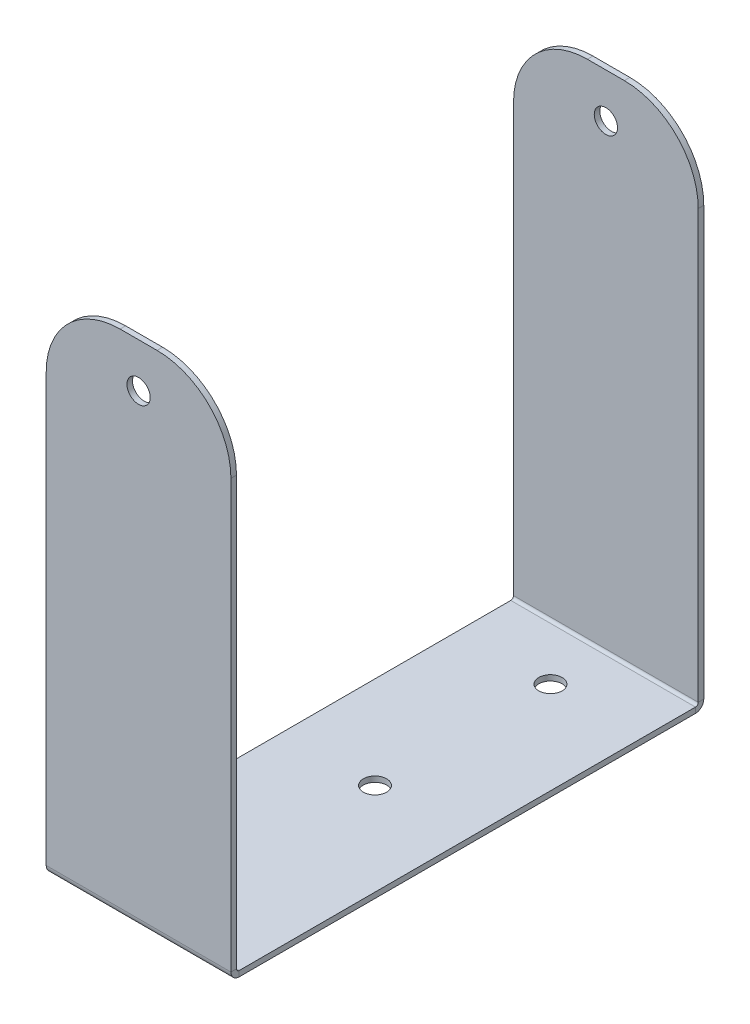
ISO-10303-21;
HEADER;
FILE_DESCRIPTION(('STEP AP214'),'2;1');
FILE_NAME('part.step','',(''),(''),'','','');
FILE_SCHEMA(('AUTOMOTIVE_DESIGN { 1 0 10303 214 1 1 1 1 }'));
ENDSEC;
DATA;
#1=APPLICATION_CONTEXT('core data for automotive mechanical design processes');
#2=APPLICATION_PROTOCOL_DEFINITION('international standard','automotive_design',2000,#1);
#3=PRODUCT_CONTEXT('',#1,'mechanical');
#4=PRODUCT('Part','Part','',(#3));
#5=PRODUCT_RELATED_PRODUCT_CATEGORY('part','',(#4));
#6=PRODUCT_DEFINITION_FORMATION('','',#4);
#7=PRODUCT_DEFINITION_CONTEXT('part definition',#1,'design');
#8=PRODUCT_DEFINITION('design','',#6,#7);
#9=PRODUCT_DEFINITION_SHAPE('','',#8);
#10=(LENGTH_UNIT() NAMED_UNIT(*) SI_UNIT(.MILLI.,.METRE.));
#11=(NAMED_UNIT(*) PLANE_ANGLE_UNIT() SI_UNIT($,.RADIAN.));
#12=(NAMED_UNIT(*) SI_UNIT($,.STERADIAN.) SOLID_ANGLE_UNIT());
#13=UNCERTAINTY_MEASURE_WITH_UNIT(LENGTH_MEASURE(1.E-05),#10,'distance_accuracy_value','');
#14=(GEOMETRIC_REPRESENTATION_CONTEXT(3) GLOBAL_UNCERTAINTY_ASSIGNED_CONTEXT((#13)) GLOBAL_UNIT_ASSIGNED_CONTEXT((#10,
#11,#12)) REPRESENTATION_CONTEXT('',''));
#15=CARTESIAN_POINT('',(0.,0.,0.));
#16=DIRECTION('',(0.,0.,1.));
#17=DIRECTION('',(1.,0.,0.));
#18=AXIS2_PLACEMENT_3D('',#15,#16,#17);
#19=CARTESIAN_POINT('',(0.,-1.5,0.));
#20=DIRECTION('',(0.,1.,0.));
#21=DIRECTION('',(0.,0.,1.));
#22=AXIS2_PLACEMENT_3D('',#19,#20,#21);
#23=PLANE('',#22);
#24=CARTESIAN_POINT('',(25.,-1.5,15.));
#25=DIRECTION('',(0.,1.,0.));
#26=DIRECTION('',(0.,0.,1.));
#27=AXIS2_PLACEMENT_3D('',#24,#25,#26);
#28=CIRCLE('',#27,3.15);
#29=CARTESIAN_POINT('',(25.,-1.5,18.15));
#30=VERTEX_POINT('',#29);
#31=EDGE_CURVE('E439',#30,#30,#28,.T.);
#32=ORIENTED_EDGE('',*,*,#31,.T.);
#33=EDGE_LOOP('',(#32));
#34=FACE_BOUND('',#33,.T.);
#35=CARTESIAN_POINT('',(25.,-1.5,62.5));
#36=DIRECTION('',(0.,1.,0.));
#37=DIRECTION('',(0.,0.,1.));
#38=AXIS2_PLACEMENT_3D('',#35,#36,#37);
#39=CIRCLE('',#38,3.15);
#40=CARTESIAN_POINT('',(25.,-1.5,65.65));
#41=VERTEX_POINT('',#40);
#42=EDGE_CURVE('E443',#41,#41,#39,.T.);
#43=ORIENTED_EDGE('',*,*,#42,.T.);
#44=EDGE_LOOP('',(#43));
#45=FACE_BOUND('',#44,.T.);
#46=CARTESIAN_POINT('',(25.,-1.5,110.));
#47=DIRECTION('',(0.,1.,0.));
#48=DIRECTION('',(0.,0.,1.));
#49=AXIS2_PLACEMENT_3D('',#46,#47,#48);
#50=CIRCLE('',#49,3.15);
#51=CARTESIAN_POINT('',(25.,-1.5,113.15));
#52=VERTEX_POINT('',#51);
#53=EDGE_CURVE('E447',#52,#52,#50,.T.);
#54=ORIENTED_EDGE('',*,*,#53,.T.);
#55=EDGE_LOOP('',(#54));
#56=FACE_BOUND('',#55,.T.);
#57=DIRECTION('',(-1.,0.,0.));
#58=VECTOR('',#57,1.);
#59=CARTESIAN_POINT('',(0.,-1.50000000000001,0.749999999999998));
#60=LINE('',#59,#58);
#61=CARTESIAN_POINT('',(0.,-1.50000000000001,0.749999999999998));
#62=VERTEX_POINT('',#61);
#63=CARTESIAN_POINT('',(50.,-1.5,0.749999999999998));
#64=VERTEX_POINT('',#63);
#65=EDGE_CURVE('E165',#62,#64,#60,.F.);
#66=ORIENTED_EDGE('',*,*,#65,.T.);
#67=DIRECTION('',(0.,0.,-1.));
#68=VECTOR('',#67,1.);
#69=CARTESIAN_POINT('',(50.,-1.5,0.));
#70=LINE('',#69,#68);
#71=CARTESIAN_POINT('',(50.,-1.5,124.25));
#72=VERTEX_POINT('',#71);
#73=EDGE_CURVE('E312',#72,#64,#70,.T.);
#74=ORIENTED_EDGE('',*,*,#73,.F.);
#75=DIRECTION('',(1.,0.,0.));
#76=VECTOR('',#75,1.);
#77=CARTESIAN_POINT('',(50.,-1.5,124.25));
#78=LINE('',#77,#76);
#79=CARTESIAN_POINT('',(0.,-1.5,124.25));
#80=VERTEX_POINT('',#79);
#81=EDGE_CURVE('E277',#72,#80,#78,.F.);
#82=ORIENTED_EDGE('',*,*,#81,.T.);
#83=DIRECTION('',(0.,0.,1.));
#84=VECTOR('',#83,1.);
#85=CARTESIAN_POINT('',(0.,-1.5,0.));
#86=LINE('',#85,#84);
#87=EDGE_CURVE('E309',#62,#80,#86,.T.);
#88=ORIENTED_EDGE('',*,*,#87,.F.);
#89=EDGE_LOOP('',(#66,#74,#82,#88));
#90=FACE_BOUND('',#89,.T.);
#91=ADVANCED_FACE('F41',(#34,#45,#56,#90),#23,.F.);
#92=CARTESIAN_POINT('',(0.,0.,0.));
#93=DIRECTION('',(0.,1.,0.));
#94=DIRECTION('',(0.,0.,1.));
#95=AXIS2_PLACEMENT_3D('',#92,#93,#94);
#96=PLANE('',#95);
#97=CARTESIAN_POINT('',(25.,0.,15.));
#98=DIRECTION('',(0.,1.,0.));
#99=DIRECTION('',(0.,0.,1.));
#100=AXIS2_PLACEMENT_3D('',#97,#98,#99);
#101=CIRCLE('',#100,3.15);
#102=CARTESIAN_POINT('',(25.,0.,18.15));
#103=VERTEX_POINT('',#102);
#104=EDGE_CURVE('E451',#103,#103,#101,.T.);
#105=ORIENTED_EDGE('',*,*,#104,.F.);
#106=EDGE_LOOP('',(#105));
#107=FACE_BOUND('',#106,.T.);
#108=CARTESIAN_POINT('',(25.,0.,62.5));
#109=DIRECTION('',(0.,1.,0.));
#110=DIRECTION('',(0.,0.,1.));
#111=AXIS2_PLACEMENT_3D('',#108,#109,#110);
#112=CIRCLE('',#111,3.15);
#113=CARTESIAN_POINT('',(25.,0.,65.65));
#114=VERTEX_POINT('',#113);
#115=EDGE_CURVE('E456',#114,#114,#112,.T.);
#116=ORIENTED_EDGE('',*,*,#115,.F.);
#117=EDGE_LOOP('',(#116));
#118=FACE_BOUND('',#117,.T.);
#119=CARTESIAN_POINT('',(25.,0.,110.));
#120=DIRECTION('',(0.,1.,0.));
#121=DIRECTION('',(0.,0.,1.));
#122=AXIS2_PLACEMENT_3D('',#119,#120,#121);
#123=CIRCLE('',#122,3.15);
#124=CARTESIAN_POINT('',(25.,0.,113.15));
#125=VERTEX_POINT('',#124);
#126=EDGE_CURVE('E452',#125,#125,#123,.T.);
#127=ORIENTED_EDGE('',*,*,#126,.F.);
#128=EDGE_LOOP('',(#127));
#129=FACE_BOUND('',#128,.T.);
#130=DIRECTION('',(0.,0.,-1.));
#131=VECTOR('',#130,1.);
#132=CARTESIAN_POINT('',(50.,0.,0.));
#133=LINE('',#132,#131);
#134=CARTESIAN_POINT('',(50.,0.,124.25));
#135=VERTEX_POINT('',#134);
#136=CARTESIAN_POINT('',(50.,0.,0.749999999999998));
#137=VERTEX_POINT('',#136);
#138=EDGE_CURVE('E313',#135,#137,#133,.T.);
#139=ORIENTED_EDGE('',*,*,#138,.T.);
#140=DIRECTION('',(-1.,0.,0.));
#141=VECTOR('',#140,1.);
#142=CARTESIAN_POINT('',(0.,0.,0.749999999999998));
#143=LINE('',#142,#141);
#144=CARTESIAN_POINT('',(0.,0.,0.749999999999998));
#145=VERTEX_POINT('',#144);
#146=EDGE_CURVE('E225',#145,#137,#143,.F.);
#147=ORIENTED_EDGE('',*,*,#146,.F.);
#148=DIRECTION('',(0.,0.,1.));
#149=VECTOR('',#148,1.);
#150=CARTESIAN_POINT('',(0.,0.,0.));
#151=LINE('',#150,#149);
#152=CARTESIAN_POINT('',(0.,0.,124.25));
#153=VERTEX_POINT('',#152);
#154=EDGE_CURVE('E305',#145,#153,#151,.T.);
#155=ORIENTED_EDGE('',*,*,#154,.T.);
#156=DIRECTION('',(1.,0.,0.));
#157=VECTOR('',#156,1.);
#158=CARTESIAN_POINT('',(50.,0.,124.25));
#159=LINE('',#158,#157);
#160=EDGE_CURVE('E294',#135,#153,#159,.F.);
#161=ORIENTED_EDGE('',*,*,#160,.F.);
#162=EDGE_LOOP('',(#139,#147,#155,#161));
#163=FACE_BOUND('',#162,.T.);
#164=ADVANCED_FACE('F417',(#107,#118,#129,#163),#96,.T.);
#165=CARTESIAN_POINT('',(0.,-1.5,0.));
#166=DIRECTION('',(-1.,0.,0.));
#167=DIRECTION('',(0.,0.,1.));
#168=AXIS2_PLACEMENT_3D('',#165,#166,#167);
#169=PLANE('',#168);
#170=ORIENTED_EDGE('',*,*,#154,.F.);
#171=DIRECTION('',(0.,-1.,0.));
#172=VECTOR('',#171,1.);
#173=CARTESIAN_POINT('',(0.,0.,0.749999999999998));
#174=LINE('',#173,#172);
#175=EDGE_CURVE('E220',#145,#62,#174,.T.);
#176=ORIENTED_EDGE('',*,*,#175,.T.);
#177=ORIENTED_EDGE('',*,*,#87,.T.);
#178=DIRECTION('',(0.,-1.,0.));
#179=VECTOR('',#178,1.);
#180=CARTESIAN_POINT('',(0.,0.,124.25));
#181=LINE('',#180,#179);
#182=EDGE_CURVE('E301',#153,#80,#181,.T.);
#183=ORIENTED_EDGE('',*,*,#182,.F.);
#184=EDGE_LOOP('',(#170,#176,#177,#183));
#185=FACE_BOUND('',#184,.T.);
#186=ADVANCED_FACE('F412',(#185),#169,.T.);
#187=CARTESIAN_POINT('',(50.,-1.5,0.));
#188=DIRECTION('',(1.,0.,0.));
#189=DIRECTION('',(0.,0.,-1.));
#190=AXIS2_PLACEMENT_3D('',#187,#188,#189);
#191=PLANE('',#190);
#192=DIRECTION('',(0.,-1.,0.));
#193=VECTOR('',#192,1.);
#194=CARTESIAN_POINT('',(50.,0.,0.749999999999998));
#195=LINE('',#194,#193);
#196=EDGE_CURVE('E231',#137,#64,#195,.T.);
#197=ORIENTED_EDGE('',*,*,#196,.F.);
#198=ORIENTED_EDGE('',*,*,#138,.F.);
#199=DIRECTION('',(0.,-1.,0.));
#200=VECTOR('',#199,1.);
#201=CARTESIAN_POINT('',(50.,0.,124.25));
#202=LINE('',#201,#200);
#203=EDGE_CURVE('E286',#135,#72,#202,.T.);
#204=ORIENTED_EDGE('',*,*,#203,.T.);
#205=ORIENTED_EDGE('',*,*,#73,.T.);
#206=EDGE_LOOP('',(#197,#198,#204,#205));
#207=FACE_BOUND('',#206,.T.);
#208=ADVANCED_FACE('F419',(#207),#191,.T.);
#209=CARTESIAN_POINT('',(0.,0.750000000000001,124.25));
#210=DIRECTION('',(-1.,0.,0.));
#211=DIRECTION('',(0.,0.,1.));
#212=AXIS2_PLACEMENT_3D('',#209,#210,#211);
#213=PLANE('',#212);
#214=DIRECTION('',(0.,0.,1.));
#215=VECTOR('',#214,1.);
#216=CARTESIAN_POINT('',(0.,0.750000000000001,125.));
#217=LINE('',#216,#215);
#218=CARTESIAN_POINT('',(0.,0.750000000000001,125.));
#219=VERTEX_POINT('',#218);
#220=CARTESIAN_POINT('',(0.,0.750000000000001,126.5));
#221=VERTEX_POINT('',#220);
#222=EDGE_CURVE('E247',#219,#221,#217,.T.);
#223=ORIENTED_EDGE('',*,*,#222,.F.);
#224=CARTESIAN_POINT('',(0.,0.750000000000001,124.25));
#225=DIRECTION('',(1.,0.,0.));
#226=DIRECTION('',(0.,0.,-1.));
#227=AXIS2_PLACEMENT_3D('',#224,#225,#226);
#228=CIRCLE('',#227,0.750000000000001);
#229=EDGE_CURVE('E290',#153,#219,#228,.F.);
#230=ORIENTED_EDGE('',*,*,#229,.F.);
#231=ORIENTED_EDGE('',*,*,#182,.T.);
#232=CARTESIAN_POINT('',(0.,0.750000000000001,124.25));
#233=DIRECTION('',(1.,0.,0.));
#234=DIRECTION('',(0.,0.,-1.));
#235=AXIS2_PLACEMENT_3D('',#232,#233,#234);
#236=CIRCLE('',#235,2.25);
#237=EDGE_CURVE('E281',#80,#221,#236,.F.);
#238=ORIENTED_EDGE('',*,*,#237,.T.);
#239=EDGE_LOOP('',(#223,#230,#231,#238));
#240=FACE_BOUND('',#239,.T.);
#241=ADVANCED_FACE('F407',(#240),#213,.T.);
#242=CARTESIAN_POINT('',(50.,0.750000000000001,124.25));
#243=DIRECTION('',(-1.,0.,0.));
#244=DIRECTION('',(0.,0.,1.));
#245=AXIS2_PLACEMENT_3D('',#242,#243,#244);
#246=PLANE('',#245);
#247=CARTESIAN_POINT('',(50.,0.750000000000001,124.25));
#248=DIRECTION('',(1.,0.,0.));
#249=DIRECTION('',(0.,0.,-1.));
#250=AXIS2_PLACEMENT_3D('',#247,#248,#249);
#251=CIRCLE('',#250,0.750000000000001);
#252=CARTESIAN_POINT('',(50.,0.750000000000001,125.));
#253=VERTEX_POINT('',#252);
#254=EDGE_CURVE('E269',#253,#135,#251,.T.);
#255=ORIENTED_EDGE('',*,*,#254,.F.);
#256=DIRECTION('',(0.,0.,1.));
#257=VECTOR('',#256,1.);
#258=CARTESIAN_POINT('',(50.,0.750000000000001,125.));
#259=LINE('',#258,#257);
#260=CARTESIAN_POINT('',(50.,0.750000000000001,126.5));
#261=VERTEX_POINT('',#260);
#262=EDGE_CURVE('E246',#253,#261,#259,.T.);
#263=ORIENTED_EDGE('',*,*,#262,.T.);
#264=CARTESIAN_POINT('',(50.,0.750000000000001,124.25));
#265=DIRECTION('',(1.,0.,0.));
#266=DIRECTION('',(0.,0.,-1.));
#267=AXIS2_PLACEMENT_3D('',#264,#265,#266);
#268=CIRCLE('',#267,2.25);
#269=EDGE_CURVE('E282',#261,#72,#268,.T.);
#270=ORIENTED_EDGE('',*,*,#269,.T.);
#271=ORIENTED_EDGE('',*,*,#203,.F.);
#272=EDGE_LOOP('',(#255,#263,#270,#271));
#273=FACE_BOUND('',#272,.T.);
#274=ADVANCED_FACE('F400',(#273),#246,.F.);
#275=CARTESIAN_POINT('',(50.,0.750000000000001,124.25));
#276=DIRECTION('',(1.,0.,0.));
#277=DIRECTION('',(0.,0.,1.));
#278=AXIS2_PLACEMENT_3D('',#275,#276,#277);
#279=CYLINDRICAL_SURFACE('',#278,2.25);
#280=ORIENTED_EDGE('',*,*,#81,.F.);
#281=ORIENTED_EDGE('',*,*,#269,.F.);
#282=DIRECTION('',(-1.,0.,0.));
#283=VECTOR('',#282,1.);
#284=CARTESIAN_POINT('',(0.,0.750000000000001,126.5));
#285=LINE('',#284,#283);
#286=EDGE_CURVE('E251',#261,#221,#285,.T.);
#287=ORIENTED_EDGE('',*,*,#286,.T.);
#288=ORIENTED_EDGE('',*,*,#237,.F.);
#289=EDGE_LOOP('',(#280,#281,#287,#288));
#290=FACE_BOUND('',#289,.T.);
#291=ADVANCED_FACE('F405',(#290),#279,.T.);
#292=CARTESIAN_POINT('',(50.,0.750000000000001,124.25));
#293=DIRECTION('',(1.,0.,0.));
#294=DIRECTION('',(0.,0.,1.));
#295=AXIS2_PLACEMENT_3D('',#292,#293,#294);
#296=CYLINDRICAL_SURFACE('',#295,0.750000000000001);
#297=ORIENTED_EDGE('',*,*,#160,.T.);
#298=ORIENTED_EDGE('',*,*,#229,.T.);
#299=DIRECTION('',(1.,0.,0.));
#300=VECTOR('',#299,1.);
#301=CARTESIAN_POINT('',(0.,0.750000000000001,125.));
#302=LINE('',#301,#300);
#303=EDGE_CURVE('E243',#219,#253,#302,.T.);
#304=ORIENTED_EDGE('',*,*,#303,.T.);
#305=ORIENTED_EDGE('',*,*,#254,.T.);
#306=EDGE_LOOP('',(#297,#298,#304,#305));
#307=FACE_BOUND('',#306,.T.);
#308=ADVANCED_FACE('F414',(#307),#296,.F.);
#309=CARTESIAN_POINT('',(50.,136.5,126.5));
#310=DIRECTION('',(-1.,0.,0.));
#311=DIRECTION('',(0.,0.,1.));
#312=AXIS2_PLACEMENT_3D('',#309,#310,#311);
#313=PLANE('',#312);
#314=DIRECTION('',(0.,1.,0.));
#315=VECTOR('',#314,1.);
#316=CARTESIAN_POINT('',(50.,136.5,125.));
#317=LINE('',#316,#315);
#318=CARTESIAN_POINT('',(50.,116.5,125.));
#319=VERTEX_POINT('',#318);
#320=EDGE_CURVE('E258',#253,#319,#317,.T.);
#321=ORIENTED_EDGE('',*,*,#320,.T.);
#322=DIRECTION('',(0.,0.,-1.));
#323=VECTOR('',#322,1.);
#324=CARTESIAN_POINT('',(50.,116.5,126.5));
#325=LINE('',#324,#323);
#326=CARTESIAN_POINT('',(50.,116.5,126.5));
#327=VERTEX_POINT('',#326);
#328=EDGE_CURVE('E11',#319,#327,#325,.F.);
#329=ORIENTED_EDGE('',*,*,#328,.T.);
#330=DIRECTION('',(0.,1.,0.));
#331=VECTOR('',#330,1.);
#332=CARTESIAN_POINT('',(50.,136.5,126.5));
#333=LINE('',#332,#331);
#334=EDGE_CURVE('E259',#261,#327,#333,.T.);
#335=ORIENTED_EDGE('',*,*,#334,.F.);
#336=ORIENTED_EDGE('',*,*,#262,.F.);
#337=EDGE_LOOP('',(#321,#329,#335,#336));
#338=FACE_BOUND('',#337,.T.);
#339=ADVANCED_FACE('F397',(#338),#313,.F.);
#340=CARTESIAN_POINT('',(0.,0.,126.5));
#341=DIRECTION('',(1.,0.,0.));
#342=DIRECTION('',(0.,1.,0.));
#343=AXIS2_PLACEMENT_3D('',#340,#341,#342);
#344=PLANE('',#343);
#345=DIRECTION('',(0.,-1.,0.));
#346=VECTOR('',#345,1.);
#347=CARTESIAN_POINT('',(0.,0.,126.5));
#348=LINE('',#347,#346);
#349=CARTESIAN_POINT('',(0.,116.5,126.5));
#350=VERTEX_POINT('',#349);
#351=EDGE_CURVE('E266',#350,#221,#348,.T.);
#352=ORIENTED_EDGE('',*,*,#351,.F.);
#353=DIRECTION('',(0.,0.,-1.));
#354=VECTOR('',#353,1.);
#355=CARTESIAN_POINT('',(0.,116.5,126.5));
#356=LINE('',#355,#354);
#357=CARTESIAN_POINT('',(0.,116.5,125.));
#358=VERTEX_POINT('',#357);
#359=EDGE_CURVE('E356',#350,#358,#356,.T.);
#360=ORIENTED_EDGE('',*,*,#359,.T.);
#361=DIRECTION('',(0.,-1.,0.));
#362=VECTOR('',#361,1.);
#363=CARTESIAN_POINT('',(0.,0.,125.));
#364=LINE('',#363,#362);
#365=EDGE_CURVE('E263',#358,#219,#364,.T.);
#366=ORIENTED_EDGE('',*,*,#365,.T.);
#367=ORIENTED_EDGE('',*,*,#222,.T.);
#368=EDGE_LOOP('',(#352,#360,#366,#367));
#369=FACE_BOUND('',#368,.T.);
#370=ADVANCED_FACE('F383',(#369),#344,.F.);
#371=CARTESIAN_POINT('',(0.,0.,126.5));
#372=DIRECTION('',(0.,0.,-1.));
#373=DIRECTION('',(-1.,0.,0.));
#374=AXIS2_PLACEMENT_3D('',#371,#372,#373);
#375=PLANE('',#374);
#376=CARTESIAN_POINT('',(25.,124.5,126.5));
#377=DIRECTION('',(0.,0.,1.));
#378=DIRECTION('',(1.,0.,0.));
#379=AXIS2_PLACEMENT_3D('',#376,#377,#378);
#380=CIRCLE('',#379,3.15);
#381=CARTESIAN_POINT('',(28.15,124.5,126.5));
#382=VERTEX_POINT('',#381);
#383=EDGE_CURVE('E235',#382,#382,#380,.T.);
#384=ORIENTED_EDGE('',*,*,#383,.F.);
#385=EDGE_LOOP('',(#384));
#386=FACE_BOUND('',#385,.T.);
#387=DIRECTION('',(-1.,0.,0.));
#388=VECTOR('',#387,1.);
#389=CARTESIAN_POINT('',(0.,136.5,126.5));
#390=LINE('',#389,#388);
#391=CARTESIAN_POINT('',(30.,136.5,126.5));
#392=VERTEX_POINT('',#391);
#393=CARTESIAN_POINT('',(20.,136.5,126.5));
#394=VERTEX_POINT('',#393);
#395=EDGE_CURVE('E262',#392,#394,#390,.T.);
#396=ORIENTED_EDGE('',*,*,#395,.T.);
#397=CARTESIAN_POINT('',(20.,116.5,126.5));
#398=DIRECTION('',(0.,0.,-1.));
#399=DIRECTION('',(-1.,0.,0.));
#400=AXIS2_PLACEMENT_3D('',#397,#398,#399);
#401=CIRCLE('',#400,20.);
#402=EDGE_CURVE('E50',#394,#350,#401,.F.);
#403=ORIENTED_EDGE('',*,*,#402,.T.);
#404=ORIENTED_EDGE('',*,*,#351,.T.);
#405=ORIENTED_EDGE('',*,*,#286,.F.);
#406=ORIENTED_EDGE('',*,*,#334,.T.);
#407=CARTESIAN_POINT('',(30.,116.5,126.5));
#408=DIRECTION('',(0.,0.,-1.));
#409=DIRECTION('',(-1.,0.,0.));
#410=AXIS2_PLACEMENT_3D('',#407,#408,#409);
#411=CIRCLE('',#410,20.);
#412=EDGE_CURVE('E372',#327,#392,#411,.F.);
#413=ORIENTED_EDGE('',*,*,#412,.T.);
#414=EDGE_LOOP('',(#396,#403,#404,#405,#406,#413));
#415=FACE_BOUND('',#414,.T.);
#416=ADVANCED_FACE('F378',(#386,#415),#375,.F.);
#417=CARTESIAN_POINT('',(0.,0.,125.));
#418=DIRECTION('',(0.,0.,-1.));
#419=DIRECTION('',(-1.,0.,0.));
#420=AXIS2_PLACEMENT_3D('',#417,#418,#419);
#421=PLANE('',#420);
#422=CARTESIAN_POINT('',(25.,124.5,125.));
#423=DIRECTION('',(0.,0.,-1.));
#424=DIRECTION('',(-1.,0.,0.));
#425=AXIS2_PLACEMENT_3D('',#422,#423,#424);
#426=CIRCLE('',#425,3.15);
#427=CARTESIAN_POINT('',(21.85,124.5,125.));
#428=VERTEX_POINT('',#427);
#429=EDGE_CURVE('E242',#428,#428,#426,.T.);
#430=ORIENTED_EDGE('',*,*,#429,.F.);
#431=EDGE_LOOP('',(#430));
#432=FACE_BOUND('',#431,.T.);
#433=ORIENTED_EDGE('',*,*,#365,.F.);
#434=CARTESIAN_POINT('',(20.,116.5,125.));
#435=DIRECTION('',(0.,0.,-1.));
#436=DIRECTION('',(-1.,0.,0.));
#437=AXIS2_PLACEMENT_3D('',#434,#435,#436);
#438=CIRCLE('',#437,20.);
#439=CARTESIAN_POINT('',(20.,136.5,125.));
#440=VERTEX_POINT('',#439);
#441=EDGE_CURVE('E363',#358,#440,#438,.T.);
#442=ORIENTED_EDGE('',*,*,#441,.T.);
#443=DIRECTION('',(-1.,0.,0.));
#444=VECTOR('',#443,1.);
#445=CARTESIAN_POINT('',(0.,136.5,125.));
#446=LINE('',#445,#444);
#447=CARTESIAN_POINT('',(30.,136.5,125.));
#448=VERTEX_POINT('',#447);
#449=EDGE_CURVE('E272',#448,#440,#446,.T.);
#450=ORIENTED_EDGE('',*,*,#449,.F.);
#451=CARTESIAN_POINT('',(30.,116.5,125.));
#452=DIRECTION('',(0.,0.,-1.));
#453=DIRECTION('',(-1.,0.,0.));
#454=AXIS2_PLACEMENT_3D('',#451,#452,#453);
#455=CIRCLE('',#454,20.);
#456=EDGE_CURVE('E360',#448,#319,#455,.T.);
#457=ORIENTED_EDGE('',*,*,#456,.T.);
#458=ORIENTED_EDGE('',*,*,#320,.F.);
#459=ORIENTED_EDGE('',*,*,#303,.F.);
#460=EDGE_LOOP('',(#433,#442,#450,#457,#458,#459));
#461=FACE_BOUND('',#460,.T.);
#462=ADVANCED_FACE('F389',(#432,#461),#421,.T.);
#463=CARTESIAN_POINT('',(0.,136.5,126.5));
#464=DIRECTION('',(0.,-1.,0.));
#465=DIRECTION('',(0.,0.,-1.));
#466=AXIS2_PLACEMENT_3D('',#463,#464,#465);
#467=PLANE('',#466);
#468=ORIENTED_EDGE('',*,*,#449,.T.);
#469=DIRECTION('',(0.,0.,-1.));
#470=VECTOR('',#469,1.);
#471=CARTESIAN_POINT('',(20.,136.5,126.5));
#472=LINE('',#471,#470);
#473=EDGE_CURVE('E63',#440,#394,#472,.F.);
#474=ORIENTED_EDGE('',*,*,#473,.T.);
#475=ORIENTED_EDGE('',*,*,#395,.F.);
#476=DIRECTION('',(0.,0.,-1.));
#477=VECTOR('',#476,1.);
#478=CARTESIAN_POINT('',(30.,136.5,126.5));
#479=LINE('',#478,#477);
#480=EDGE_CURVE('E366',#392,#448,#479,.T.);
#481=ORIENTED_EDGE('',*,*,#480,.T.);
#482=EDGE_LOOP('',(#468,#474,#475,#481));
#483=FACE_BOUND('',#482,.T.);
#484=ADVANCED_FACE('F391',(#483),#467,.F.);
#485=CARTESIAN_POINT('',(25.,124.5,-49.5));
#486=DIRECTION('',(0.,0.,1.));
#487=DIRECTION('',(1.,0.,0.));
#488=AXIS2_PLACEMENT_3D('',#485,#486,#487);
#489=CYLINDRICAL_SURFACE('',#488,3.15);
#490=ORIENTED_EDGE('',*,*,#429,.T.);
#491=EDGE_LOOP('',(#490));
#492=FACE_BOUND('',#491,.T.);
#493=ORIENTED_EDGE('',*,*,#383,.T.);
#494=EDGE_LOOP('',(#493));
#495=FACE_BOUND('',#494,.T.);
#496=ADVANCED_FACE('F654',(#492,#495),#489,.F.);
#497=CARTESIAN_POINT('',(50.,0.749999999999992,0.749999999999997));
#498=DIRECTION('',(1.,0.,0.));
#499=DIRECTION('',(0.,0.,-1.));
#500=AXIS2_PLACEMENT_3D('',#497,#498,#499);
#501=PLANE('',#500);
#502=DIRECTION('',(0.,0.,-1.));
#503=VECTOR('',#502,1.);
#504=CARTESIAN_POINT('',(50.,0.749999999999997,0.));
#505=LINE('',#504,#503);
#506=CARTESIAN_POINT('',(50.,0.749999999999989,0.));
#507=VERTEX_POINT('',#506);
#508=CARTESIAN_POINT('',(50.,0.749999999999984,-1.5));
#509=VERTEX_POINT('',#508);
#510=EDGE_CURVE('E330',#507,#509,#505,.T.);
#511=ORIENTED_EDGE('',*,*,#510,.F.);
#512=CARTESIAN_POINT('',(50.,0.749999999999992,0.749999999999997));
#513=DIRECTION('',(-1.,0.,0.));
#514=DIRECTION('',(0.,0.,1.));
#515=AXIS2_PLACEMENT_3D('',#512,#513,#514);
#516=CIRCLE('',#515,0.75);
#517=EDGE_CURVE('E169',#137,#507,#516,.F.);
#518=ORIENTED_EDGE('',*,*,#517,.F.);
#519=ORIENTED_EDGE('',*,*,#196,.T.);
#520=CARTESIAN_POINT('',(50.,0.749999999999992,0.749999999999997));
#521=DIRECTION('',(-1.,0.,0.));
#522=DIRECTION('',(0.,0.,1.));
#523=AXIS2_PLACEMENT_3D('',#520,#521,#522);
#524=CIRCLE('',#523,2.25);
#525=EDGE_CURVE('E218',#64,#509,#524,.F.);
#526=ORIENTED_EDGE('',*,*,#525,.T.);
#527=EDGE_LOOP('',(#511,#518,#519,#526));
#528=FACE_BOUND('',#527,.T.);
#529=ADVANCED_FACE('F423',(#528),#501,.T.);
#530=CARTESIAN_POINT('',(0.,0.749999999999992,0.749999999999997));
#531=DIRECTION('',(1.,0.,0.));
#532=DIRECTION('',(0.,0.,-1.));
#533=AXIS2_PLACEMENT_3D('',#530,#531,#532);
#534=PLANE('',#533);
#535=CARTESIAN_POINT('',(0.,0.749999999999992,0.749999999999997));
#536=DIRECTION('',(-1.,0.,0.));
#537=DIRECTION('',(0.,0.,1.));
#538=AXIS2_PLACEMENT_3D('',#535,#536,#537);
#539=CIRCLE('',#538,0.75);
#540=CARTESIAN_POINT('',(0.,0.749999999999989,0.));
#541=VERTEX_POINT('',#540);
#542=EDGE_CURVE('E176',#541,#145,#539,.T.);
#543=ORIENTED_EDGE('',*,*,#542,.F.);
#544=DIRECTION('',(0.,0.,-1.));
#545=VECTOR('',#544,1.);
#546=CARTESIAN_POINT('',(0.,0.749999999999997,0.));
#547=LINE('',#546,#545);
#548=CARTESIAN_POINT('',(0.,0.750000000000008,-1.5));
#549=VERTEX_POINT('',#548);
#550=EDGE_CURVE('E173',#541,#549,#547,.T.);
#551=ORIENTED_EDGE('',*,*,#550,.T.);
#552=CARTESIAN_POINT('',(0.,0.749999999999992,0.749999999999997));
#553=DIRECTION('',(-1.,0.,0.));
#554=DIRECTION('',(0.,0.,1.));
#555=AXIS2_PLACEMENT_3D('',#552,#553,#554);
#556=CIRCLE('',#555,2.25);
#557=EDGE_CURVE('E158',#549,#62,#556,.T.);
#558=ORIENTED_EDGE('',*,*,#557,.T.);
#559=ORIENTED_EDGE('',*,*,#175,.F.);
#560=EDGE_LOOP('',(#543,#551,#558,#559));
#561=FACE_BOUND('',#560,.T.);
#562=ADVANCED_FACE('F174',(#561),#534,.F.);
#563=CARTESIAN_POINT('',(0.,0.749999999999992,0.749999999999997));
#564=DIRECTION('',(-1.,0.,0.));
#565=DIRECTION('',(0.,0.,-1.));
#566=AXIS2_PLACEMENT_3D('',#563,#564,#565);
#567=CYLINDRICAL_SURFACE('',#566,2.25);
#568=ORIENTED_EDGE('',*,*,#65,.F.);
#569=ORIENTED_EDGE('',*,*,#557,.F.);
#570=DIRECTION('',(1.,0.,0.));
#571=VECTOR('',#570,1.);
#572=CARTESIAN_POINT('',(0.,0.750000000000008,-1.5));
#573=LINE('',#572,#571);
#574=EDGE_CURVE('E163',#549,#509,#573,.T.);
#575=ORIENTED_EDGE('',*,*,#574,.T.);
#576=ORIENTED_EDGE('',*,*,#525,.F.);
#577=EDGE_LOOP('',(#568,#569,#575,#576));
#578=FACE_BOUND('',#577,.T.);
#579=ADVANCED_FACE('F160',(#578),#567,.T.);
#580=CARTESIAN_POINT('',(0.,0.749999999999992,0.749999999999997));
#581=DIRECTION('',(-1.,0.,0.));
#582=DIRECTION('',(0.,0.,-1.));
#583=AXIS2_PLACEMENT_3D('',#580,#581,#582);
#584=CYLINDRICAL_SURFACE('',#583,0.75);
#585=ORIENTED_EDGE('',*,*,#146,.T.);
#586=ORIENTED_EDGE('',*,*,#517,.T.);
#587=DIRECTION('',(-1.,0.,0.));
#588=VECTOR('',#587,1.);
#589=CARTESIAN_POINT('',(50.,0.749999999999997,0.));
#590=LINE('',#589,#588);
#591=EDGE_CURVE('E182',#507,#541,#590,.T.);
#592=ORIENTED_EDGE('',*,*,#591,.T.);
#593=ORIENTED_EDGE('',*,*,#542,.T.);
#594=EDGE_LOOP('',(#585,#586,#592,#593));
#595=FACE_BOUND('',#594,.T.);
#596=ADVANCED_FACE('F427',(#595),#584,.F.);
#597=CARTESIAN_POINT('',(0.,136.5,-1.50000000000048));
#598=DIRECTION('',(1.,0.,0.));
#599=DIRECTION('',(0.,0.,-1.));
#600=AXIS2_PLACEMENT_3D('',#597,#598,#599);
#601=PLANE('',#600);
#602=DIRECTION('',(0.,1.,0.));
#603=VECTOR('',#602,1.);
#604=CARTESIAN_POINT('',(0.,136.5,-4.76587202752088E-13));
#605=LINE('',#604,#603);
#606=CARTESIAN_POINT('',(0.,116.5,-4.06757575975225E-13));
#607=VERTEX_POINT('',#606);
#608=EDGE_CURVE('E192',#541,#607,#605,.T.);
#609=ORIENTED_EDGE('',*,*,#608,.T.);
#610=DIRECTION('',(0.,0.,1.));
#611=VECTOR('',#610,1.);
#612=CARTESIAN_POINT('',(0.,116.5,-1.50000000000041));
#613=LINE('',#612,#611);
#614=CARTESIAN_POINT('',(0.,116.5,-1.50000000000041));
#615=VERTEX_POINT('',#614);
#616=EDGE_CURVE('E196',#607,#615,#613,.F.);
#617=ORIENTED_EDGE('',*,*,#616,.T.);
#618=DIRECTION('',(0.,1.,0.));
#619=VECTOR('',#618,1.);
#620=CARTESIAN_POINT('',(0.,136.5,-1.50000000000048));
#621=LINE('',#620,#619);
#622=EDGE_CURVE('E187',#549,#615,#621,.T.);
#623=ORIENTED_EDGE('',*,*,#622,.F.);
#624=ORIENTED_EDGE('',*,*,#550,.F.);
#625=EDGE_LOOP('',(#609,#617,#623,#624));
#626=FACE_BOUND('',#625,.T.);
#627=ADVANCED_FACE('F194',(#626),#601,.F.);
#628=CARTESIAN_POINT('',(50.,0.,-1.5));
#629=DIRECTION('',(-1.,0.,0.));
#630=DIRECTION('',(0.,0.,1.));
#631=AXIS2_PLACEMENT_3D('',#628,#629,#630);
#632=PLANE('',#631);
#633=DIRECTION('',(0.,-1.,0.));
#634=VECTOR('',#633,1.);
#635=CARTESIAN_POINT('',(50.,0.,-1.5));
#636=LINE('',#635,#634);
#637=CARTESIAN_POINT('',(50.,116.5,-1.50000000000041));
#638=VERTEX_POINT('',#637);
#639=EDGE_CURVE('E190',#638,#509,#636,.T.);
#640=ORIENTED_EDGE('',*,*,#639,.F.);
#641=DIRECTION('',(0.,0.,1.));
#642=VECTOR('',#641,1.);
#643=CARTESIAN_POINT('',(50.,116.5,-1.50000000000041));
#644=LINE('',#643,#642);
#645=CARTESIAN_POINT('',(50.,116.5,-4.06757575975225E-13));
#646=VERTEX_POINT('',#645);
#647=EDGE_CURVE('E352',#638,#646,#644,.T.);
#648=ORIENTED_EDGE('',*,*,#647,.T.);
#649=DIRECTION('',(0.,-1.,0.));
#650=VECTOR('',#649,1.);
#651=CARTESIAN_POINT('',(50.,0.,0.));
#652=LINE('',#651,#650);
#653=EDGE_CURVE('E199',#646,#507,#652,.T.);
#654=ORIENTED_EDGE('',*,*,#653,.T.);
#655=ORIENTED_EDGE('',*,*,#510,.T.);
#656=EDGE_LOOP('',(#640,#648,#654,#655));
#657=FACE_BOUND('',#656,.T.);
#658=ADVANCED_FACE('F597',(#657),#632,.F.);
#659=CARTESIAN_POINT('',(0.,0.,-1.5));
#660=DIRECTION('',(0.,0.,1.));
#661=DIRECTION('',(0.,-1.,0.));
#662=AXIS2_PLACEMENT_3D('',#659,#660,#661);
#663=PLANE('',#662);
#664=CARTESIAN_POINT('',(25.,124.5,-1.50000000000043));
#665=DIRECTION('',(0.,0.,-1.));
#666=DIRECTION('',(0.,1.,0.));
#667=AXIS2_PLACEMENT_3D('',#664,#665,#666);
#668=CIRCLE('',#667,3.15);
#669=CARTESIAN_POINT('',(25.,127.65,-1.50000000000045));
#670=VERTEX_POINT('',#669);
#671=EDGE_CURVE('E331',#670,#670,#668,.T.);
#672=ORIENTED_EDGE('',*,*,#671,.F.);
#673=EDGE_LOOP('',(#672));
#674=FACE_BOUND('',#673,.T.);
#675=ORIENTED_EDGE('',*,*,#622,.T.);
#676=CARTESIAN_POINT('',(20.,116.5,-1.50000000000041));
#677=DIRECTION('',(0.,0.,1.));
#678=DIRECTION('',(0.,-1.,0.));
#679=AXIS2_PLACEMENT_3D('',#676,#677,#678);
#680=CIRCLE('',#679,20.);
#681=CARTESIAN_POINT('',(20.,136.5,-1.50000000000048));
#682=VERTEX_POINT('',#681);
#683=EDGE_CURVE('E349',#615,#682,#680,.F.);
#684=ORIENTED_EDGE('',*,*,#683,.T.);
#685=DIRECTION('',(1.,0.,0.));
#686=VECTOR('',#685,1.);
#687=CARTESIAN_POINT('',(50.,136.5,-1.50000000000048));
#688=LINE('',#687,#686);
#689=CARTESIAN_POINT('',(30.,136.5,-1.50000000000048));
#690=VERTEX_POINT('',#689);
#691=EDGE_CURVE('E198',#682,#690,#688,.T.);
#692=ORIENTED_EDGE('',*,*,#691,.T.);
#693=CARTESIAN_POINT('',(30.,116.5,-1.50000000000041));
#694=DIRECTION('',(0.,0.,1.));
#695=DIRECTION('',(0.,-1.,0.));
#696=AXIS2_PLACEMENT_3D('',#693,#694,#695);
#697=CIRCLE('',#696,20.);
#698=EDGE_CURVE('E346',#690,#638,#697,.F.);
#699=ORIENTED_EDGE('',*,*,#698,.T.);
#700=ORIENTED_EDGE('',*,*,#639,.T.);
#701=ORIENTED_EDGE('',*,*,#574,.F.);
#702=EDGE_LOOP('',(#675,#684,#692,#699,#700,#701));
#703=FACE_BOUND('',#702,.T.);
#704=ADVANCED_FACE('F186',(#674,#703),#663,.F.);
#705=CARTESIAN_POINT('',(0.,0.,0.));
#706=DIRECTION('',(0.,0.,1.));
#707=DIRECTION('',(0.,-1.,0.));
#708=AXIS2_PLACEMENT_3D('',#705,#706,#707);
#709=PLANE('',#708);
#710=CARTESIAN_POINT('',(25.,124.5,-4.35415592470179E-13));
#711=DIRECTION('',(0.,0.,1.));
#712=DIRECTION('',(0.,-1.,0.));
#713=AXIS2_PLACEMENT_3D('',#710,#711,#712);
#714=CIRCLE('',#713,3.15);
#715=CARTESIAN_POINT('',(25.,121.35,-4.24417426252823E-13));
#716=VERTEX_POINT('',#715);
#717=EDGE_CURVE('E326',#716,#716,#714,.T.);
#718=ORIENTED_EDGE('',*,*,#717,.F.);
#719=EDGE_LOOP('',(#718));
#720=FACE_BOUND('',#719,.T.);
#721=DIRECTION('',(1.,0.,0.));
#722=VECTOR('',#721,1.);
#723=CARTESIAN_POINT('',(50.,136.5,-4.76587202752088E-13));
#724=LINE('',#723,#722);
#725=CARTESIAN_POINT('',(20.,136.5,-4.76587202752088E-13));
#726=VERTEX_POINT('',#725);
#727=CARTESIAN_POINT('',(30.,136.5,-4.76587202752088E-13));
#728=VERTEX_POINT('',#727);
#729=EDGE_CURVE('E205',#726,#728,#724,.T.);
#730=ORIENTED_EDGE('',*,*,#729,.F.);
#731=CARTESIAN_POINT('',(20.,116.5,-4.06792655116561E-13));
#732=DIRECTION('',(0.,0.,1.));
#733=DIRECTION('',(0.,-1.,0.));
#734=AXIS2_PLACEMENT_3D('',#731,#732,#733);
#735=CIRCLE('',#734,20.);
#736=EDGE_CURVE('E341',#726,#607,#735,.T.);
#737=ORIENTED_EDGE('',*,*,#736,.T.);
#738=ORIENTED_EDGE('',*,*,#608,.F.);
#739=ORIENTED_EDGE('',*,*,#591,.F.);
#740=ORIENTED_EDGE('',*,*,#653,.F.);
#741=CARTESIAN_POINT('',(30.,116.5,-4.06792655116561E-13));
#742=DIRECTION('',(0.,0.,1.));
#743=DIRECTION('',(0.,-1.,0.));
#744=AXIS2_PLACEMENT_3D('',#741,#742,#743);
#745=CIRCLE('',#744,20.);
#746=EDGE_CURVE('E338',#646,#728,#745,.T.);
#747=ORIENTED_EDGE('',*,*,#746,.T.);
#748=EDGE_LOOP('',(#730,#737,#738,#739,#740,#747));
#749=FACE_BOUND('',#748,.T.);
#750=ADVANCED_FACE('F431',(#720,#749),#709,.T.);
#751=CARTESIAN_POINT('',(50.,136.5,-1.50000000000048));
#752=DIRECTION('',(0.,-1.,0.));
#753=DIRECTION('',(0.,0.,-1.));
#754=AXIS2_PLACEMENT_3D('',#751,#752,#753);
#755=PLANE('',#754);
#756=ORIENTED_EDGE('',*,*,#691,.F.);
#757=DIRECTION('',(0.,0.,1.));
#758=VECTOR('',#757,1.);
#759=CARTESIAN_POINT('',(20.,136.5,-1.50000000000048));
#760=LINE('',#759,#758);
#761=EDGE_CURVE('E334',#682,#726,#760,.T.);
#762=ORIENTED_EDGE('',*,*,#761,.T.);
#763=ORIENTED_EDGE('',*,*,#729,.T.);
#764=DIRECTION('',(0.,0.,1.));
#765=VECTOR('',#764,1.);
#766=CARTESIAN_POINT('',(30.,136.5,-1.50000000000048));
#767=LINE('',#766,#765);
#768=EDGE_CURVE('E317',#728,#690,#767,.F.);
#769=ORIENTED_EDGE('',*,*,#768,.T.);
#770=EDGE_LOOP('',(#756,#762,#763,#769));
#771=FACE_BOUND('',#770,.T.);
#772=ADVANCED_FACE('F565',(#771),#755,.F.);
#773=CARTESIAN_POINT('',(25.,124.5,8.49999999999956));
#774=DIRECTION('',(0.,0.,-1.));
#775=DIRECTION('',(0.,1.,0.));
#776=AXIS2_PLACEMENT_3D('',#773,#774,#775);
#777=CYLINDRICAL_SURFACE('',#776,3.15);
#778=ORIENTED_EDGE('',*,*,#717,.T.);
#779=EDGE_LOOP('',(#778));
#780=FACE_BOUND('',#779,.T.);
#781=ORIENTED_EDGE('',*,*,#671,.T.);
#782=EDGE_LOOP('',(#781));
#783=FACE_BOUND('',#782,.T.);
#784=ADVANCED_FACE('F499',(#780,#783),#777,.F.);
#785=CARTESIAN_POINT('',(20.,116.5,-1.50000000000041));
#786=DIRECTION('',(0.,0.,1.));
#787=DIRECTION('',(0.,-1.,0.));
#788=AXIS2_PLACEMENT_3D('',#785,#786,#787);
#789=CYLINDRICAL_SURFACE('',#788,20.);
#790=ORIENTED_EDGE('',*,*,#683,.F.);
#791=ORIENTED_EDGE('',*,*,#616,.F.);
#792=ORIENTED_EDGE('',*,*,#736,.F.);
#793=ORIENTED_EDGE('',*,*,#761,.F.);
#794=EDGE_LOOP('',(#790,#791,#792,#793));
#795=FACE_BOUND('',#794,.T.);
#796=ADVANCED_FACE('F495',(#795),#789,.T.);
#797=CARTESIAN_POINT('',(30.,116.5,-1.50000000000041));
#798=DIRECTION('',(0.,0.,1.));
#799=DIRECTION('',(0.,-1.,0.));
#800=AXIS2_PLACEMENT_3D('',#797,#798,#799);
#801=CYLINDRICAL_SURFACE('',#800,20.);
#802=ORIENTED_EDGE('',*,*,#698,.F.);
#803=ORIENTED_EDGE('',*,*,#768,.F.);
#804=ORIENTED_EDGE('',*,*,#746,.F.);
#805=ORIENTED_EDGE('',*,*,#647,.F.);
#806=EDGE_LOOP('',(#802,#803,#804,#805));
#807=FACE_BOUND('',#806,.T.);
#808=ADVANCED_FACE('F498',(#807),#801,.T.);
#809=CARTESIAN_POINT('',(20.,116.5,126.5));
#810=DIRECTION('',(0.,0.,-1.));
#811=DIRECTION('',(-1.,0.,0.));
#812=AXIS2_PLACEMENT_3D('',#809,#810,#811);
#813=CYLINDRICAL_SURFACE('',#812,20.);
#814=ORIENTED_EDGE('',*,*,#402,.F.);
#815=ORIENTED_EDGE('',*,*,#473,.F.);
#816=ORIENTED_EDGE('',*,*,#441,.F.);
#817=ORIENTED_EDGE('',*,*,#359,.F.);
#818=EDGE_LOOP('',(#814,#815,#816,#817));
#819=FACE_BOUND('',#818,.T.);
#820=ADVANCED_FACE('F386',(#819),#813,.T.);
#821=CARTESIAN_POINT('',(30.,116.5,126.5));
#822=DIRECTION('',(0.,0.,-1.));
#823=DIRECTION('',(-1.,0.,0.));
#824=AXIS2_PLACEMENT_3D('',#821,#822,#823);
#825=CYLINDRICAL_SURFACE('',#824,20.);
#826=ORIENTED_EDGE('',*,*,#412,.F.);
#827=ORIENTED_EDGE('',*,*,#328,.F.);
#828=ORIENTED_EDGE('',*,*,#456,.F.);
#829=ORIENTED_EDGE('',*,*,#480,.F.);
#830=EDGE_LOOP('',(#826,#827,#828,#829));
#831=FACE_BOUND('',#830,.T.);
#832=ADVANCED_FACE('F43',(#831),#825,.T.);
#833=CARTESIAN_POINT('',(25.,-10.,110.));
#834=DIRECTION('',(0.,1.,0.));
#835=DIRECTION('',(0.,0.,1.));
#836=AXIS2_PLACEMENT_3D('',#833,#834,#835);
#837=CYLINDRICAL_SURFACE('',#836,3.15);
#838=ORIENTED_EDGE('',*,*,#126,.T.);
#839=EDGE_LOOP('',(#838));
#840=FACE_BOUND('',#839,.T.);
#841=ORIENTED_EDGE('',*,*,#53,.F.);
#842=EDGE_LOOP('',(#841));
#843=FACE_BOUND('',#842,.T.);
#844=ADVANCED_FACE('F474',(#840,#843),#837,.F.);
#845=CARTESIAN_POINT('',(25.,-10.,62.5));
#846=DIRECTION('',(0.,1.,0.));
#847=DIRECTION('',(0.,0.,1.));
#848=AXIS2_PLACEMENT_3D('',#845,#846,#847);
#849=CYLINDRICAL_SURFACE('',#848,3.15);
#850=ORIENTED_EDGE('',*,*,#115,.T.);
#851=EDGE_LOOP('',(#850));
#852=FACE_BOUND('',#851,.T.);
#853=ORIENTED_EDGE('',*,*,#42,.F.);
#854=EDGE_LOOP('',(#853));
#855=FACE_BOUND('',#854,.T.);
#856=ADVANCED_FACE('F477',(#852,#855),#849,.F.);
#857=CARTESIAN_POINT('',(25.,-10.,15.));
#858=DIRECTION('',(0.,1.,0.));
#859=DIRECTION('',(0.,0.,1.));
#860=AXIS2_PLACEMENT_3D('',#857,#858,#859);
#861=CYLINDRICAL_SURFACE('',#860,3.15);
#862=ORIENTED_EDGE('',*,*,#104,.T.);
#863=EDGE_LOOP('',(#862));
#864=FACE_BOUND('',#863,.T.);
#865=ORIENTED_EDGE('',*,*,#31,.F.);
#866=EDGE_LOOP('',(#865));
#867=FACE_BOUND('',#866,.T.);
#868=ADVANCED_FACE('F464',(#864,#867),#861,.F.);
#869=CLOSED_SHELL('',(#91,#164,#186,#208,#241,#274,#291,#308,#339,#370,#416,#462,#484,#496,#529,
#562,#579,#596,#627,#658,#704,#750,#772,#784,#796,#808,#820,#832,#844,#856,#868));
#870=MANIFOLD_SOLID_BREP('B2',#869);
#871=ADVANCED_BREP_SHAPE_REPRESENTATION('',(#18,#870),#14);
#872=SHAPE_DEFINITION_REPRESENTATION(#9,#871);
ENDSEC;
END-ISO-10303-21;
